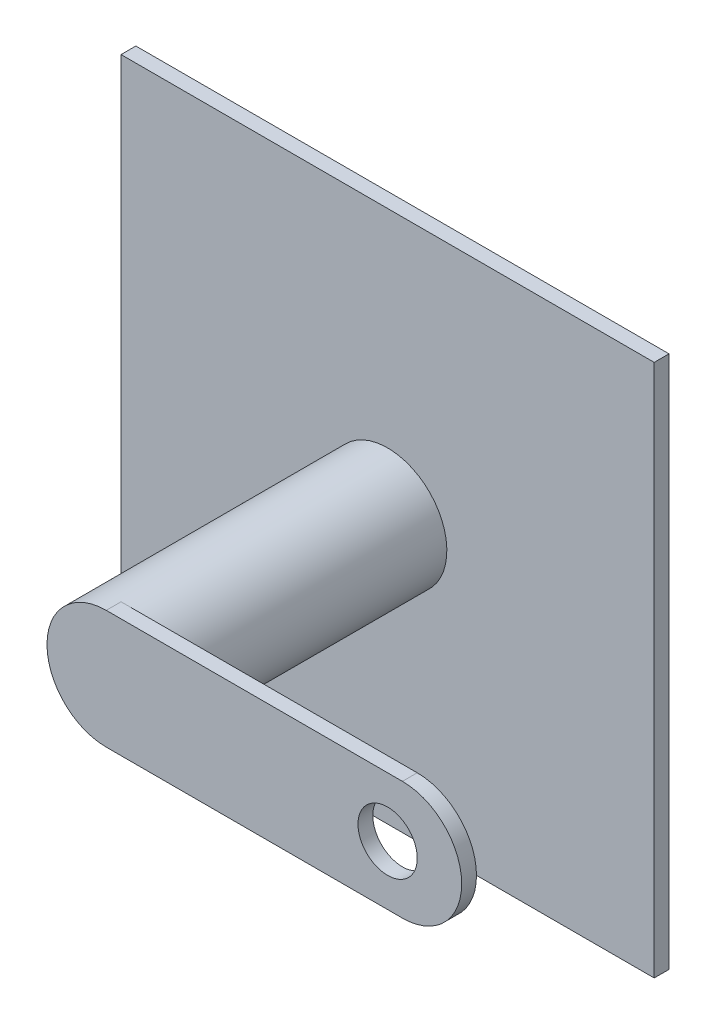
ISO-10303-21;
HEADER;
FILE_DESCRIPTION(('STEP AP214'),'2;1');
FILE_NAME('part.step','',(''),(''),'','','');
FILE_SCHEMA(('AUTOMOTIVE_DESIGN { 1 0 10303 214 1 1 1 1 }'));
ENDSEC;
DATA;
#1=APPLICATION_CONTEXT('core data for automotive mechanical design processes');
#2=APPLICATION_PROTOCOL_DEFINITION('international standard','automotive_design',2000,#1);
#3=PRODUCT_CONTEXT('',#1,'mechanical');
#4=PRODUCT('Part','Part','',(#3));
#5=PRODUCT_RELATED_PRODUCT_CATEGORY('part','',(#4));
#6=PRODUCT_DEFINITION_FORMATION('','',#4);
#7=PRODUCT_DEFINITION_CONTEXT('part definition',#1,'design');
#8=PRODUCT_DEFINITION('design','',#6,#7);
#9=PRODUCT_DEFINITION_SHAPE('','',#8);
#10=(LENGTH_UNIT() NAMED_UNIT(*) SI_UNIT(.MILLI.,.METRE.));
#11=(NAMED_UNIT(*) PLANE_ANGLE_UNIT() SI_UNIT($,.RADIAN.));
#12=(NAMED_UNIT(*) SI_UNIT($,.STERADIAN.) SOLID_ANGLE_UNIT());
#13=UNCERTAINTY_MEASURE_WITH_UNIT(LENGTH_MEASURE(1.E-05),#10,'distance_accuracy_value','');
#14=(GEOMETRIC_REPRESENTATION_CONTEXT(3) GLOBAL_UNCERTAINTY_ASSIGNED_CONTEXT((#13)) GLOBAL_UNIT_ASSIGNED_CONTEXT((#10,
#11,#12)) REPRESENTATION_CONTEXT('',''));
#15=CARTESIAN_POINT('',(0.,0.,0.));
#16=DIRECTION('',(0.,0.,1.));
#17=DIRECTION('',(1.,0.,0.));
#18=AXIS2_PLACEMENT_3D('',#15,#16,#17);
#19=CARTESIAN_POINT('',(-90.,-90.,4.99999999999969));
#20=DIRECTION('',(0.,1.,0.));
#21=DIRECTION('',(-1.,0.,0.));
#22=AXIS2_PLACEMENT_3D('',#19,#20,#21);
#23=PLANE('',#22);
#24=DIRECTION('',(1.,0.,0.));
#25=VECTOR('',#24,1.);
#26=CARTESIAN_POINT('',(-90.,-90.,-3.14233320495882E-13));
#27=LINE('',#26,#25);
#28=CARTESIAN_POINT('',(-90.,-90.,-3.14233320495882E-13));
#29=VERTEX_POINT('',#28);
#30=CARTESIAN_POINT('',(90.,-90.,-3.14233320495882E-13));
#31=VERTEX_POINT('',#30);
#32=EDGE_CURVE('E146',#29,#31,#27,.T.);
#33=ORIENTED_EDGE('',*,*,#32,.T.);
#34=DIRECTION('',(0.,0.,-1.));
#35=VECTOR('',#34,1.);
#36=CARTESIAN_POINT('',(90.,-90.,4.99999999999969));
#37=LINE('',#36,#35);
#38=CARTESIAN_POINT('',(90.,-90.,4.99999999999969));
#39=VERTEX_POINT('',#38);
#40=EDGE_CURVE('E149',#39,#31,#37,.T.);
#41=ORIENTED_EDGE('',*,*,#40,.F.);
#42=DIRECTION('',(1.,0.,0.));
#43=VECTOR('',#42,1.);
#44=CARTESIAN_POINT('',(-90.,-90.,4.99999999999969));
#45=LINE('',#44,#43);
#46=CARTESIAN_POINT('',(-90.,-90.,4.99999999999969));
#47=VERTEX_POINT('',#46);
#48=EDGE_CURVE('E85',#47,#39,#45,.T.);
#49=ORIENTED_EDGE('',*,*,#48,.F.);
#50=DIRECTION('',(0.,0.,-1.));
#51=VECTOR('',#50,1.);
#52=CARTESIAN_POINT('',(-90.,-90.,4.99999999999969));
#53=LINE('',#52,#51);
#54=EDGE_CURVE('E158',#47,#29,#53,.T.);
#55=ORIENTED_EDGE('',*,*,#54,.T.);
#56=EDGE_LOOP('',(#33,#41,#49,#55));
#57=FACE_BOUND('',#56,.T.);
#58=ADVANCED_FACE('F36',(#57),#23,.F.);
#59=CARTESIAN_POINT('',(90.,90.,5.00000000000031));
#60=DIRECTION('',(1.,0.,0.));
#61=DIRECTION('',(0.,1.,0.));
#62=AXIS2_PLACEMENT_3D('',#59,#60,#61);
#63=PLANE('',#62);
#64=DIRECTION('',(0.,-1.,0.));
#65=VECTOR('',#64,1.);
#66=CARTESIAN_POINT('',(90.,90.,3.14233320495882E-13));
#67=LINE('',#66,#65);
#68=CARTESIAN_POINT('',(90.,90.,3.14233320495882E-13));
#69=VERTEX_POINT('',#68);
#70=EDGE_CURVE('E161',#69,#31,#67,.T.);
#71=ORIENTED_EDGE('',*,*,#70,.F.);
#72=DIRECTION('',(0.,0.,-1.));
#73=VECTOR('',#72,1.);
#74=CARTESIAN_POINT('',(90.,90.,5.00000000000031));
#75=LINE('',#74,#73);
#76=CARTESIAN_POINT('',(90.,90.,5.00000000000031));
#77=VERTEX_POINT('',#76);
#78=EDGE_CURVE('E171',#77,#69,#75,.T.);
#79=ORIENTED_EDGE('',*,*,#78,.F.);
#80=DIRECTION('',(0.,-1.,0.));
#81=VECTOR('',#80,1.);
#82=CARTESIAN_POINT('',(90.,90.,5.00000000000031));
#83=LINE('',#82,#81);
#84=EDGE_CURVE('E151',#77,#39,#83,.T.);
#85=ORIENTED_EDGE('',*,*,#84,.T.);
#86=ORIENTED_EDGE('',*,*,#40,.T.);
#87=EDGE_LOOP('',(#71,#79,#85,#86));
#88=FACE_BOUND('',#87,.T.);
#89=ADVANCED_FACE('F174',(#88),#63,.T.);
#90=CARTESIAN_POINT('',(-90.,90.,5.00000000000031));
#91=DIRECTION('',(0.,1.,0.));
#92=DIRECTION('',(-1.,0.,0.));
#93=AXIS2_PLACEMENT_3D('',#90,#91,#92);
#94=PLANE('',#93);
#95=DIRECTION('',(1.,0.,0.));
#96=VECTOR('',#95,1.);
#97=CARTESIAN_POINT('',(-90.,90.,3.14233320495882E-13));
#98=LINE('',#97,#96);
#99=CARTESIAN_POINT('',(-90.,90.,3.14233320495882E-13));
#100=VERTEX_POINT('',#99);
#101=EDGE_CURVE('E164',#100,#69,#98,.T.);
#102=ORIENTED_EDGE('',*,*,#101,.F.);
#103=DIRECTION('',(0.,0.,-1.));
#104=VECTOR('',#103,1.);
#105=CARTESIAN_POINT('',(-90.,90.,5.00000000000031));
#106=LINE('',#105,#104);
#107=CARTESIAN_POINT('',(-90.,90.,5.00000000000031));
#108=VERTEX_POINT('',#107);
#109=EDGE_CURVE('E169',#108,#100,#106,.T.);
#110=ORIENTED_EDGE('',*,*,#109,.F.);
#111=DIRECTION('',(1.,0.,0.));
#112=VECTOR('',#111,1.);
#113=CARTESIAN_POINT('',(-90.,90.,5.00000000000031));
#114=LINE('',#113,#112);
#115=EDGE_CURVE('E154',#108,#77,#114,.T.);
#116=ORIENTED_EDGE('',*,*,#115,.T.);
#117=ORIENTED_EDGE('',*,*,#78,.T.);
#118=EDGE_LOOP('',(#102,#110,#116,#117));
#119=FACE_BOUND('',#118,.T.);
#120=ADVANCED_FACE('F181',(#119),#94,.T.);
#121=CARTESIAN_POINT('',(-90.,90.,5.00000000000031));
#122=DIRECTION('',(1.,0.,0.));
#123=DIRECTION('',(0.,1.,0.));
#124=AXIS2_PLACEMENT_3D('',#121,#122,#123);
#125=PLANE('',#124);
#126=DIRECTION('',(0.,-1.,0.));
#127=VECTOR('',#126,1.);
#128=CARTESIAN_POINT('',(-90.,90.,3.14233320495882E-13));
#129=LINE('',#128,#127);
#130=EDGE_CURVE('E80',#100,#29,#129,.T.);
#131=ORIENTED_EDGE('',*,*,#130,.T.);
#132=ORIENTED_EDGE('',*,*,#54,.F.);
#133=DIRECTION('',(0.,-1.,0.));
#134=VECTOR('',#133,1.);
#135=CARTESIAN_POINT('',(-90.,90.,5.00000000000031));
#136=LINE('',#135,#134);
#137=EDGE_CURVE('E59',#108,#47,#136,.T.);
#138=ORIENTED_EDGE('',*,*,#137,.F.);
#139=ORIENTED_EDGE('',*,*,#109,.T.);
#140=EDGE_LOOP('',(#131,#132,#138,#139));
#141=FACE_BOUND('',#140,.T.);
#142=ADVANCED_FACE('F184',(#141),#125,.F.);
#143=CARTESIAN_POINT('',(0.,0.,5.));
#144=DIRECTION('',(0.,0.,-1.));
#145=DIRECTION('',(0.,1.,0.));
#146=AXIS2_PLACEMENT_3D('',#143,#144,#145);
#147=PLANE('',#146);
#148=CARTESIAN_POINT('',(0.,0.,5.));
#149=DIRECTION('',(0.,0.,1.));
#150=DIRECTION('',(0.,-1.,0.));
#151=AXIS2_PLACEMENT_3D('',#148,#149,#150);
#152=CIRCLE('',#151,20.);
#153=CARTESIAN_POINT('',(0.,-20.,4.99999999999993));
#154=VERTEX_POINT('',#153);
#155=EDGE_CURVE('E43',#154,#154,#152,.T.);
#156=ORIENTED_EDGE('',*,*,#155,.F.);
#157=EDGE_LOOP('',(#156));
#158=FACE_BOUND('',#157,.T.);
#159=ORIENTED_EDGE('',*,*,#48,.T.);
#160=ORIENTED_EDGE('',*,*,#84,.F.);
#161=ORIENTED_EDGE('',*,*,#115,.F.);
#162=ORIENTED_EDGE('',*,*,#137,.T.);
#163=EDGE_LOOP('',(#159,#160,#161,#162));
#164=FACE_BOUND('',#163,.T.);
#165=ADVANCED_FACE('F182',(#158,#164),#147,.F.);
#166=CARTESIAN_POINT('',(0.,0.,0.));
#167=DIRECTION('',(0.,0.,-1.));
#168=DIRECTION('',(0.,1.,0.));
#169=AXIS2_PLACEMENT_3D('',#166,#167,#168);
#170=PLANE('',#169);
#171=ORIENTED_EDGE('',*,*,#32,.F.);
#172=ORIENTED_EDGE('',*,*,#130,.F.);
#173=ORIENTED_EDGE('',*,*,#101,.T.);
#174=ORIENTED_EDGE('',*,*,#70,.T.);
#175=EDGE_LOOP('',(#171,#172,#173,#174));
#176=FACE_BOUND('',#175,.T.);
#177=ADVANCED_FACE('F178',(#176),#170,.T.);
#178=CARTESIAN_POINT('',(0.,-3.35270346076499E-13,100.));
#179=DIRECTION('',(0.,0.,-1.));
#180=DIRECTION('',(0.,1.,0.));
#181=AXIS2_PLACEMENT_3D('',#178,#179,#180);
#182=CYLINDRICAL_SURFACE('',#181,20.);
#183=CARTESIAN_POINT('',(0.,-3.35270346076499E-13,100.));
#184=DIRECTION('',(0.,0.,1.));
#185=DIRECTION('',(0.,-1.,0.));
#186=AXIS2_PLACEMENT_3D('',#183,#184,#185);
#187=CIRCLE('',#186,20.);
#188=CARTESIAN_POINT('',(0.,19.9999999999997,100.));
#189=VERTEX_POINT('',#188);
#190=CARTESIAN_POINT('',(0.,-20.0000000000004,99.9999999999999));
#191=VERTEX_POINT('',#190);
#192=EDGE_CURVE('E124',#189,#191,#187,.T.);
#193=ORIENTED_EDGE('',*,*,#192,.F.);
#194=DIRECTION('',(0.,0.,1.));
#195=VECTOR('',#194,1.);
#196=CARTESIAN_POINT('',(0.,19.9999999999997,95.0000000000001));
#197=LINE('',#196,#195);
#198=CARTESIAN_POINT('',(0.,19.9999999999997,95.0000000000001));
#199=VERTEX_POINT('',#198);
#200=EDGE_CURVE('E131',#199,#189,#197,.T.);
#201=ORIENTED_EDGE('',*,*,#200,.F.);
#202=CARTESIAN_POINT('',(0.,-3.17812939382283E-13,95.));
#203=DIRECTION('',(0.,0.,1.));
#204=DIRECTION('',(0.,-1.,0.));
#205=AXIS2_PLACEMENT_3D('',#202,#203,#204);
#206=CIRCLE('',#205,20.);
#207=CARTESIAN_POINT('',(0.,-20.0000000000003,94.9999999999999));
#208=VERTEX_POINT('',#207);
#209=EDGE_CURVE('E11',#208,#199,#206,.T.);
#210=ORIENTED_EDGE('',*,*,#209,.F.);
#211=DIRECTION('',(0.,0.,1.));
#212=VECTOR('',#211,1.);
#213=CARTESIAN_POINT('',(0.,-20.0000000000003,94.9999999999999));
#214=LINE('',#213,#212);
#215=EDGE_CURVE('E141',#208,#191,#214,.T.);
#216=ORIENTED_EDGE('',*,*,#215,.T.);
#217=EDGE_LOOP('',(#193,#201,#210,#216));
#218=FACE_BOUND('',#217,.T.);
#219=ORIENTED_EDGE('',*,*,#155,.T.);
#220=EDGE_LOOP('',(#219));
#221=FACE_BOUND('',#220,.T.);
#222=ADVANCED_FACE('F191',(#218,#221),#182,.T.);
#223=CARTESIAN_POINT('',(0.,-3.35270346076499E-13,100.));
#224=DIRECTION('',(0.,0.,1.));
#225=DIRECTION('',(0.,-1.,0.));
#226=AXIS2_PLACEMENT_3D('',#223,#224,#225);
#227=PLANE('',#226);
#228=CARTESIAN_POINT('',(95.,-3.49148133884313E-13,100.));
#229=DIRECTION('',(0.,0.,1.));
#230=DIRECTION('',(0.,-1.,0.));
#231=AXIS2_PLACEMENT_3D('',#228,#229,#230);
#232=CIRCLE('',#231,9.99999999999999);
#233=CARTESIAN_POINT('',(95.,-10.0000000000003,100.));
#234=VERTEX_POINT('',#233);
#235=EDGE_CURVE('E292',#234,#234,#232,.T.);
#236=ORIENTED_EDGE('',*,*,#235,.F.);
#237=EDGE_LOOP('',(#236));
#238=FACE_BOUND('',#237,.T.);
#239=ORIENTED_EDGE('',*,*,#192,.T.);
#240=DIRECTION('',(-1.,0.,0.));
#241=VECTOR('',#240,1.);
#242=CARTESIAN_POINT('',(100.,-20.0000000000004,99.9999999999999));
#243=LINE('',#242,#241);
#244=CARTESIAN_POINT('',(100.,-20.0000000000004,99.9999999999999));
#245=VERTEX_POINT('',#244);
#246=EDGE_CURVE('E118',#245,#191,#243,.T.);
#247=ORIENTED_EDGE('',*,*,#246,.F.);
#248=CARTESIAN_POINT('',(100.,-3.35270346076499E-13,100.));
#249=DIRECTION('',(0.,0.,1.));
#250=DIRECTION('',(0.,-1.,0.));
#251=AXIS2_PLACEMENT_3D('',#248,#249,#250);
#252=CIRCLE('',#251,20.);
#253=CARTESIAN_POINT('',(100.,19.9999999999997,100.));
#254=VERTEX_POINT('',#253);
#255=EDGE_CURVE('E136',#245,#254,#252,.T.);
#256=ORIENTED_EDGE('',*,*,#255,.T.);
#257=DIRECTION('',(1.,0.,0.));
#258=VECTOR('',#257,1.);
#259=CARTESIAN_POINT('',(0.,19.9999999999997,100.));
#260=LINE('',#259,#258);
#261=EDGE_CURVE('E50',#189,#254,#260,.T.);
#262=ORIENTED_EDGE('',*,*,#261,.F.);
#263=EDGE_LOOP('',(#239,#247,#256,#262));
#264=FACE_BOUND('',#263,.T.);
#265=ADVANCED_FACE('F230',(#238,#264),#227,.T.);
#266=CARTESIAN_POINT('',(100.,-3.17812939382283E-13,95.));
#267=DIRECTION('',(0.,0.,1.));
#268=DIRECTION('',(0.,-1.,0.));
#269=AXIS2_PLACEMENT_3D('',#266,#267,#268);
#270=PLANE('',#269);
#271=CARTESIAN_POINT('',(95.,-3.31690727190098E-13,95.));
#272=DIRECTION('',(0.,0.,1.));
#273=DIRECTION('',(0.,-1.,0.));
#274=AXIS2_PLACEMENT_3D('',#271,#272,#273);
#275=CIRCLE('',#274,9.99999999999999);
#276=CARTESIAN_POINT('',(95.,-10.0000000000003,95.));
#277=VERTEX_POINT('',#276);
#278=EDGE_CURVE('E137',#277,#277,#275,.F.);
#279=ORIENTED_EDGE('',*,*,#278,.F.);
#280=EDGE_LOOP('',(#279));
#281=FACE_BOUND('',#280,.T.);
#282=DIRECTION('',(-1.,0.,0.));
#283=VECTOR('',#282,1.);
#284=CARTESIAN_POINT('',(100.,-20.0000000000004,94.9999999999999));
#285=LINE('',#284,#283);
#286=CARTESIAN_POINT('',(100.,-20.0000000000004,94.9999999999999));
#287=VERTEX_POINT('',#286);
#288=EDGE_CURVE('E129',#287,#208,#285,.T.);
#289=ORIENTED_EDGE('',*,*,#288,.T.);
#290=ORIENTED_EDGE('',*,*,#209,.T.);
#291=DIRECTION('',(1.,0.,0.));
#292=VECTOR('',#291,1.);
#293=CARTESIAN_POINT('',(0.,19.9999999999997,95.0000000000001));
#294=LINE('',#293,#292);
#295=CARTESIAN_POINT('',(100.,19.9999999999997,95.0000000000001));
#296=VERTEX_POINT('',#295);
#297=EDGE_CURVE('E110',#199,#296,#294,.T.);
#298=ORIENTED_EDGE('',*,*,#297,.T.);
#299=CARTESIAN_POINT('',(100.,-3.17812939382283E-13,95.));
#300=DIRECTION('',(0.,0.,1.));
#301=DIRECTION('',(0.,-1.,0.));
#302=AXIS2_PLACEMENT_3D('',#299,#300,#301);
#303=CIRCLE('',#302,20.);
#304=EDGE_CURVE('E114',#287,#296,#303,.T.);
#305=ORIENTED_EDGE('',*,*,#304,.F.);
#306=EDGE_LOOP('',(#289,#290,#298,#305));
#307=FACE_BOUND('',#306,.T.);
#308=ADVANCED_FACE('F112',(#281,#307),#270,.F.);
#309=CARTESIAN_POINT('',(0.,19.9999999999997,95.0000000000001));
#310=DIRECTION('',(0.,-1.,0.));
#311=DIRECTION('',(1.,0.,0.));
#312=AXIS2_PLACEMENT_3D('',#309,#310,#311);
#313=PLANE('',#312);
#314=ORIENTED_EDGE('',*,*,#261,.T.);
#315=DIRECTION('',(0.,0.,1.));
#316=VECTOR('',#315,1.);
#317=CARTESIAN_POINT('',(100.,19.9999999999997,95.0000000000001));
#318=LINE('',#317,#316);
#319=EDGE_CURVE('E120',#296,#254,#318,.T.);
#320=ORIENTED_EDGE('',*,*,#319,.F.);
#321=ORIENTED_EDGE('',*,*,#297,.F.);
#322=ORIENTED_EDGE('',*,*,#200,.T.);
#323=EDGE_LOOP('',(#314,#320,#321,#322));
#324=FACE_BOUND('',#323,.T.);
#325=ADVANCED_FACE('F121',(#324),#313,.F.);
#326=CARTESIAN_POINT('',(100.,-3.17812939382283E-13,95.));
#327=DIRECTION('',(0.,0.,1.));
#328=DIRECTION('',(0.,-1.,0.));
#329=AXIS2_PLACEMENT_3D('',#326,#327,#328);
#330=CYLINDRICAL_SURFACE('',#329,20.);
#331=ORIENTED_EDGE('',*,*,#255,.F.);
#332=DIRECTION('',(0.,0.,1.));
#333=VECTOR('',#332,1.);
#334=CARTESIAN_POINT('',(100.,-20.0000000000004,94.9999999999999));
#335=LINE('',#334,#333);
#336=EDGE_CURVE('E125',#287,#245,#335,.T.);
#337=ORIENTED_EDGE('',*,*,#336,.F.);
#338=ORIENTED_EDGE('',*,*,#304,.T.);
#339=ORIENTED_EDGE('',*,*,#319,.T.);
#340=EDGE_LOOP('',(#331,#337,#338,#339));
#341=FACE_BOUND('',#340,.T.);
#342=ADVANCED_FACE('F127',(#341),#330,.T.);
#343=CARTESIAN_POINT('',(100.,-20.0000000000004,94.9999999999999));
#344=DIRECTION('',(0.,1.,0.));
#345=DIRECTION('',(-1.,0.,0.));
#346=AXIS2_PLACEMENT_3D('',#343,#344,#345);
#347=PLANE('',#346);
#348=ORIENTED_EDGE('',*,*,#246,.T.);
#349=ORIENTED_EDGE('',*,*,#215,.F.);
#350=ORIENTED_EDGE('',*,*,#288,.F.);
#351=ORIENTED_EDGE('',*,*,#336,.T.);
#352=EDGE_LOOP('',(#348,#349,#350,#351));
#353=FACE_BOUND('',#352,.T.);
#354=ADVANCED_FACE('F266',(#353),#347,.F.);
#355=CARTESIAN_POINT('',(95.,0.,-0.001000000000001));
#356=DIRECTION('',(0.,0.,1.));
#357=DIRECTION('',(0.,-1.,0.));
#358=AXIS2_PLACEMENT_3D('',#355,#356,#357);
#359=CYLINDRICAL_SURFACE('',#358,9.99999999999999);
#360=ORIENTED_EDGE('',*,*,#235,.T.);
#361=EDGE_LOOP('',(#360));
#362=FACE_BOUND('',#361,.T.);
#363=ORIENTED_EDGE('',*,*,#278,.T.);
#364=EDGE_LOOP('',(#363));
#365=FACE_BOUND('',#364,.T.);
#366=ADVANCED_FACE('F275',(#362,#365),#359,.F.);
#367=CLOSED_SHELL('',(#58,#89,#120,#142,#165,#177,#222,#265,#308,#325,#342,#354,#366));
#368=MANIFOLD_SOLID_BREP('B2',#367);
#369=ADVANCED_BREP_SHAPE_REPRESENTATION('',(#18,#368),#14);
#370=SHAPE_DEFINITION_REPRESENTATION(#9,#369);
ENDSEC;
END-ISO-10303-21;
